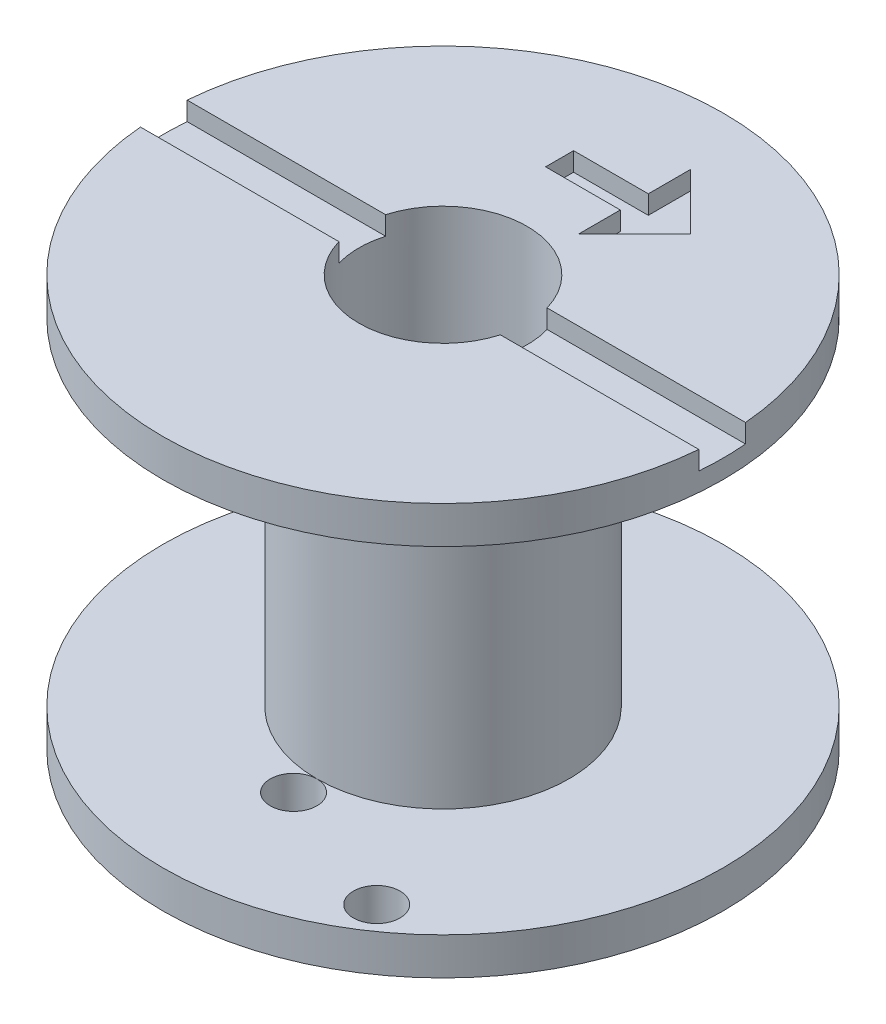
ISO-10303-21;
HEADER;
FILE_DESCRIPTION(('STEP AP214'),'2;1');
FILE_NAME('part.step','',(''),(''),'','','');
FILE_SCHEMA(('AUTOMOTIVE_DESIGN { 1 0 10303 214 1 1 1 1 }'));
ENDSEC;
DATA;
#1=APPLICATION_CONTEXT('core data for automotive mechanical design processes');
#2=APPLICATION_PROTOCOL_DEFINITION('international standard','automotive_design',2000,#1);
#3=PRODUCT_CONTEXT('',#1,'mechanical');
#4=PRODUCT('Part','Part','',(#3));
#5=PRODUCT_RELATED_PRODUCT_CATEGORY('part','',(#4));
#6=PRODUCT_DEFINITION_FORMATION('','',#4);
#7=PRODUCT_DEFINITION_CONTEXT('part definition',#1,'design');
#8=PRODUCT_DEFINITION('design','',#6,#7);
#9=PRODUCT_DEFINITION_SHAPE('','',#8);
#10=(LENGTH_UNIT() NAMED_UNIT(*) SI_UNIT(.MILLI.,.METRE.));
#11=(NAMED_UNIT(*) PLANE_ANGLE_UNIT() SI_UNIT($,.RADIAN.));
#12=(NAMED_UNIT(*) SI_UNIT($,.STERADIAN.) SOLID_ANGLE_UNIT());
#13=UNCERTAINTY_MEASURE_WITH_UNIT(LENGTH_MEASURE(1.E-05),#10,'distance_accuracy_value','');
#14=(GEOMETRIC_REPRESENTATION_CONTEXT(3) GLOBAL_UNCERTAINTY_ASSIGNED_CONTEXT((#13)) GLOBAL_UNIT_ASSIGNED_CONTEXT((#10,
#11,#12)) REPRESENTATION_CONTEXT('',''));
#15=CARTESIAN_POINT('',(0.,0.,0.));
#16=DIRECTION('',(0.,0.,1.));
#17=DIRECTION('',(1.,0.,0.));
#18=AXIS2_PLACEMENT_3D('',#15,#16,#17);
#19=CARTESIAN_POINT('',(0.,11.,15.));
#20=DIRECTION('',(0.,1.,0.));
#21=DIRECTION('',(0.,0.,1.));
#22=AXIS2_PLACEMENT_3D('',#19,#20,#21);
#23=PLANE('',#22);
#24=DIRECTION('',(1.,0.,0.));
#25=VECTOR('',#24,1.);
#26=CARTESIAN_POINT('',(0.,11.,1.25));
#27=LINE('',#26,#25);
#28=CARTESIAN_POINT('',(-14.9478259288767,11.,1.25));
#29=VERTEX_POINT('',#28);
#30=CARTESIAN_POINT('',(-4.32290411644765,11.,1.25));
#31=VERTEX_POINT('',#30);
#32=EDGE_CURVE('E265',#29,#31,#27,.T.);
#33=ORIENTED_EDGE('',*,*,#32,.F.);
#34=CARTESIAN_POINT('',(0.,11.,0.));
#35=DIRECTION('',(0.,1.,0.));
#36=DIRECTION('',(0.,0.,1.));
#37=AXIS2_PLACEMENT_3D('',#34,#35,#36);
#38=CIRCLE('',#37,15.);
#39=CARTESIAN_POINT('',(14.9478259288767,11.,1.25));
#40=VERTEX_POINT('',#39);
#41=EDGE_CURVE('E218',#29,#40,#38,.T.);
#42=ORIENTED_EDGE('',*,*,#41,.T.);
#43=CARTESIAN_POINT('',(4.32290411644765,11.,1.25));
#44=VERTEX_POINT('',#43);
#45=EDGE_CURVE('E268',#44,#40,#27,.T.);
#46=ORIENTED_EDGE('',*,*,#45,.F.);
#47=CARTESIAN_POINT('',(0.,11.,0.));
#48=DIRECTION('',(0.,1.,0.));
#49=DIRECTION('',(0.,0.,1.));
#50=AXIS2_PLACEMENT_3D('',#47,#48,#49);
#51=CIRCLE('',#50,4.50000000000001);
#52=EDGE_CURVE('E180',#31,#44,#51,.T.);
#53=ORIENTED_EDGE('',*,*,#52,.F.);
#54=EDGE_LOOP('',(#33,#42,#46,#53));
#55=FACE_BOUND('',#54,.T.);
#56=ADVANCED_FACE('F33',(#55),#23,.T.);
#57=DIRECTION('',(-1.,0.,0.));
#58=VECTOR('',#57,1.);
#59=CARTESIAN_POINT('',(0.,11.,-1.25));
#60=LINE('',#59,#58);
#61=CARTESIAN_POINT('',(14.9478259288767,11.,-1.25));
#62=VERTEX_POINT('',#61);
#63=CARTESIAN_POINT('',(4.32290411644765,11.,-1.25));
#64=VERTEX_POINT('',#63);
#65=EDGE_CURVE('E403',#62,#64,#60,.T.);
#66=ORIENTED_EDGE('',*,*,#65,.F.);
#67=CARTESIAN_POINT('',(-14.9478259288767,11.,-1.25));
#68=VERTEX_POINT('',#67);
#69=EDGE_CURVE('E222',#62,#68,#38,.T.);
#70=ORIENTED_EDGE('',*,*,#69,.T.);
#71=CARTESIAN_POINT('',(-4.32290411644765,11.,-1.25));
#72=VERTEX_POINT('',#71);
#73=EDGE_CURVE('E270',#72,#68,#60,.T.);
#74=ORIENTED_EDGE('',*,*,#73,.F.);
#75=EDGE_CURVE('E183',#64,#72,#51,.T.);
#76=ORIENTED_EDGE('',*,*,#75,.F.);
#77=EDGE_LOOP('',(#66,#70,#74,#76));
#78=FACE_BOUND('',#77,.T.);
#79=DIRECTION('',(0.,0.,1.));
#80=VECTOR('',#79,1.);
#81=CARTESIAN_POINT('',(-2.25827734000175,11.,-7.75));
#82=LINE('',#81,#80);
#83=CARTESIAN_POINT('',(-2.25827734000175,11.,-9.25));
#84=VERTEX_POINT('',#83);
#85=CARTESIAN_POINT('',(-2.25827734000175,11.,-7.75));
#86=VERTEX_POINT('',#85);
#87=EDGE_CURVE('E274',#84,#86,#82,.T.);
#88=ORIENTED_EDGE('',*,*,#87,.F.);
#89=DIRECTION('',(-1.,0.,0.));
#90=VECTOR('',#89,1.);
#91=CARTESIAN_POINT('',(-2.25827734000175,11.,-9.25));
#92=LINE('',#91,#90);
#93=CARTESIAN_POINT('',(1.74172265999826,11.,-9.25));
#94=VERTEX_POINT('',#93);
#95=EDGE_CURVE('E285',#94,#84,#92,.T.);
#96=ORIENTED_EDGE('',*,*,#95,.F.);
#97=DIRECTION('',(0.,0.,1.));
#98=VECTOR('',#97,1.);
#99=CARTESIAN_POINT('',(1.74172265999826,11.,-9.25));
#100=LINE('',#99,#98);
#101=CARTESIAN_POINT('',(1.74172265999825,11.,-11.5000002328018));
#102=VERTEX_POINT('',#101);
#103=EDGE_CURVE('E314',#102,#94,#100,.T.);
#104=ORIENTED_EDGE('',*,*,#103,.F.);
#105=DIRECTION('',(-0.707106753750594,0.,-0.7071068086225));
#106=VECTOR('',#105,1.);
#107=CARTESIAN_POINT('',(1.74172265999825,11.,-11.5000002328018));
#108=LINE('',#107,#106);
#109=CARTESIAN_POINT('',(4.74172265999825,11.,-8.5));
#110=VERTEX_POINT('',#109);
#111=EDGE_CURVE('E311',#110,#102,#108,.T.);
#112=ORIENTED_EDGE('',*,*,#111,.F.);
#113=DIRECTION('',(0.707106808622502,0.,-0.707106753750592));
#114=VECTOR('',#113,1.);
#115=CARTESIAN_POINT('',(4.74172265999825,11.,-8.5));
#116=LINE('',#115,#114);
#117=CARTESIAN_POINT('',(1.74172265999825,11.,-5.50000023280179));
#118=VERTEX_POINT('',#117);
#119=EDGE_CURVE('E308',#118,#110,#116,.T.);
#120=ORIENTED_EDGE('',*,*,#119,.F.);
#121=DIRECTION('',(0.,0.,1.));
#122=VECTOR('',#121,1.);
#123=CARTESIAN_POINT('',(1.74172265999825,11.,-5.50000023280179));
#124=LINE('',#123,#122);
#125=CARTESIAN_POINT('',(1.74172265999826,11.,-7.75));
#126=VERTEX_POINT('',#125);
#127=EDGE_CURVE('E305',#126,#118,#124,.T.);
#128=ORIENTED_EDGE('',*,*,#127,.F.);
#129=DIRECTION('',(1.,0.,0.));
#130=VECTOR('',#129,1.);
#131=CARTESIAN_POINT('',(1.74172265999826,11.,-7.75));
#132=LINE('',#131,#130);
#133=EDGE_CURVE('E278',#86,#126,#132,.T.);
#134=ORIENTED_EDGE('',*,*,#133,.F.);
#135=EDGE_LOOP('',(#88,#96,#104,#112,#120,#128,#134));
#136=FACE_BOUND('',#135,.T.);
#137=ADVANCED_FACE('F35',(#78,#136),#23,.T.);
#138=CARTESIAN_POINT('',(0.,15.5,0.));
#139=DIRECTION('',(0.,1.,0.));
#140=DIRECTION('',(0.,0.,1.));
#141=AXIS2_PLACEMENT_3D('',#138,#139,#140);
#142=CYLINDRICAL_SURFACE('',#141,4.5);
#143=DIRECTION('',(0.,1.,0.));
#144=VECTOR('',#143,1.);
#145=CARTESIAN_POINT('',(4.32290411644765,15.5,1.25));
#146=LINE('',#145,#144);
#147=CARTESIAN_POINT('',(4.32290411644765,9.99999999999998,1.25));
#148=VERTEX_POINT('',#147);
#149=EDGE_CURVE('E272',#148,#44,#146,.T.);
#150=ORIENTED_EDGE('',*,*,#149,.F.);
#151=CARTESIAN_POINT('',(0.,9.99999999999998,0.));
#152=DIRECTION('',(0.,-1.,0.));
#153=DIRECTION('',(0.,0.,-1.));
#154=AXIS2_PLACEMENT_3D('',#151,#152,#153);
#155=CIRCLE('',#154,4.5);
#156=CARTESIAN_POINT('',(4.32290411644765,9.99999999999998,-1.25));
#157=VERTEX_POINT('',#156);
#158=EDGE_CURVE('E402',#157,#148,#155,.T.);
#159=ORIENTED_EDGE('',*,*,#158,.F.);
#160=DIRECTION('',(0.,1.,0.));
#161=VECTOR('',#160,1.);
#162=CARTESIAN_POINT('',(4.32290411644765,15.5,-1.25));
#163=LINE('',#162,#161);
#164=EDGE_CURVE('E405',#64,#157,#163,.F.);
#165=ORIENTED_EDGE('',*,*,#164,.F.);
#166=ORIENTED_EDGE('',*,*,#75,.T.);
#167=DIRECTION('',(0.,1.,0.));
#168=VECTOR('',#167,1.);
#169=CARTESIAN_POINT('',(-4.32290411644765,15.5,-1.25));
#170=LINE('',#169,#168);
#171=CARTESIAN_POINT('',(-4.32290411644765,9.99999999999998,-1.25));
#172=VERTEX_POINT('',#171);
#173=EDGE_CURVE('E266',#172,#72,#170,.T.);
#174=ORIENTED_EDGE('',*,*,#173,.F.);
#175=CARTESIAN_POINT('',(-4.32290411644765,9.99999999999998,1.25));
#176=VERTEX_POINT('',#175);
#177=EDGE_CURVE('E400',#176,#172,#155,.T.);
#178=ORIENTED_EDGE('',*,*,#177,.F.);
#179=DIRECTION('',(0.,1.,0.));
#180=VECTOR('',#179,1.);
#181=CARTESIAN_POINT('',(-4.32290411644765,15.5,1.25));
#182=LINE('',#181,#180);
#183=EDGE_CURVE('E210',#31,#176,#182,.F.);
#184=ORIENTED_EDGE('',*,*,#183,.F.);
#185=ORIENTED_EDGE('',*,*,#52,.T.);
#186=EDGE_LOOP('',(#150,#159,#165,#166,#174,#178,#184,#185));
#187=FACE_BOUND('',#186,.T.);
#188=CARTESIAN_POINT('',(0.,-13.,0.));
#189=DIRECTION('',(0.,1.,0.));
#190=DIRECTION('',(0.,0.,1.));
#191=AXIS2_PLACEMENT_3D('',#188,#189,#190);
#192=CIRCLE('',#191,4.5);
#193=CARTESIAN_POINT('',(0.,-13.,4.5));
#194=VERTEX_POINT('',#193);
#195=EDGE_CURVE('E171',#194,#194,#192,.T.);
#196=ORIENTED_EDGE('',*,*,#195,.F.);
#197=EDGE_LOOP('',(#196));
#198=FACE_BOUND('',#197,.T.);
#199=ADVANCED_FACE('F262',(#187,#198),#142,.F.);
#200=CARTESIAN_POINT('',(0.,-13.,8.5));
#201=DIRECTION('',(0.,-1.,0.));
#202=DIRECTION('',(0.,0.,-1.));
#203=AXIS2_PLACEMENT_3D('',#200,#201,#202);
#204=PLANE('',#203);
#205=CARTESIAN_POINT('',(0.,-13.,8.));
#206=DIRECTION('',(0.,-1.,0.));
#207=DIRECTION('',(0.,0.,-1.));
#208=AXIS2_PLACEMENT_3D('',#205,#206,#207);
#209=CIRCLE('',#208,1.25);
#210=CARTESIAN_POINT('',(-1.17805013646425,-13.,8.41796875));
#211=VERTEX_POINT('',#210);
#212=CARTESIAN_POINT('',(1.17805013646425,-13.,8.41796875));
#213=VERTEX_POINT('',#212);
#214=EDGE_CURVE('E392',#211,#213,#209,.T.);
#215=ORIENTED_EDGE('',*,*,#214,.F.);
#216=CARTESIAN_POINT('',(0.,-13.,0.));
#217=DIRECTION('',(0.,1.,0.));
#218=DIRECTION('',(0.,0.,1.));
#219=AXIS2_PLACEMENT_3D('',#216,#217,#218);
#220=CIRCLE('',#219,8.5);
#221=EDGE_CURVE('E165',#213,#211,#220,.T.);
#222=ORIENTED_EDGE('',*,*,#221,.F.);
#223=EDGE_LOOP('',(#215,#222));
#224=FACE_BOUND('',#223,.T.);
#225=ORIENTED_EDGE('',*,*,#195,.T.);
#226=EDGE_LOOP('',(#225));
#227=FACE_BOUND('',#226,.T.);
#228=ADVANCED_FACE('F505',(#224,#227),#204,.T.);
#229=CARTESIAN_POINT('',(0.,15.5,0.));
#230=DIRECTION('',(0.,1.,0.));
#231=DIRECTION('',(0.,0.,1.));
#232=AXIS2_PLACEMENT_3D('',#229,#230,#231);
#233=CYLINDRICAL_SURFACE('',#232,8.5);
#234=DIRECTION('',(0.,-1.,0.));
#235=VECTOR('',#234,1.);
#236=CARTESIAN_POINT('',(1.17805013646425,-11.,8.41796875));
#237=LINE('',#236,#235);
#238=CARTESIAN_POINT('',(1.17805013646425,-11.,8.41796875));
#239=VERTEX_POINT('',#238);
#240=EDGE_CURVE('E49',#213,#239,#237,.F.);
#241=ORIENTED_EDGE('',*,*,#240,.F.);
#242=ORIENTED_EDGE('',*,*,#221,.T.);
#243=DIRECTION('',(0.,-1.,0.));
#244=VECTOR('',#243,1.);
#245=CARTESIAN_POINT('',(-1.17805013646425,-11.,8.41796875));
#246=LINE('',#245,#244);
#247=CARTESIAN_POINT('',(-1.17805013646425,-11.,8.41796875));
#248=VERTEX_POINT('',#247);
#249=EDGE_CURVE('E154',#248,#211,#246,.T.);
#250=ORIENTED_EDGE('',*,*,#249,.F.);
#251=CARTESIAN_POINT('',(0.,-11.,0.));
#252=DIRECTION('',(0.,1.,0.));
#253=DIRECTION('',(0.,0.,1.));
#254=AXIS2_PLACEMENT_3D('',#251,#252,#253);
#255=CIRCLE('',#254,8.5);
#256=EDGE_CURVE('E163',#239,#248,#255,.T.);
#257=ORIENTED_EDGE('',*,*,#256,.F.);
#258=EDGE_LOOP('',(#241,#242,#250,#257));
#259=FACE_BOUND('',#258,.T.);
#260=ADVANCED_FACE('F162',(#259),#233,.T.);
#261=CARTESIAN_POINT('',(0.,-11.,15.));
#262=DIRECTION('',(0.,-1.,0.));
#263=DIRECTION('',(0.,0.,-1.));
#264=AXIS2_PLACEMENT_3D('',#261,#262,#263);
#265=PLANE('',#264);
#266=CARTESIAN_POINT('',(0.,-11.,8.));
#267=DIRECTION('',(0.,-1.,0.));
#268=DIRECTION('',(0.,0.,-1.));
#269=AXIS2_PLACEMENT_3D('',#266,#267,#268);
#270=CIRCLE('',#269,1.25);
#271=EDGE_CURVE('E151',#239,#248,#270,.T.);
#272=ORIENTED_EDGE('',*,*,#271,.F.);
#273=ORIENTED_EDGE('',*,*,#256,.T.);
#274=EDGE_LOOP('',(#272,#273));
#275=FACE_BOUND('',#274,.T.);
#276=CARTESIAN_POINT('',(7.42542500182777,-11.,10.973858188542));
#277=DIRECTION('',(0.,-1.,0.));
#278=DIRECTION('',(0.,0.,-1.));
#279=AXIS2_PLACEMENT_3D('',#276,#277,#278);
#280=CIRCLE('',#279,1.25);
#281=CARTESIAN_POINT('',(7.42542500182777,-11.,9.72385818854203));
#282=VERTEX_POINT('',#281);
#283=EDGE_CURVE('E394',#282,#282,#280,.T.);
#284=ORIENTED_EDGE('',*,*,#283,.F.);
#285=EDGE_LOOP('',(#284));
#286=FACE_BOUND('',#285,.T.);
#287=CARTESIAN_POINT('',(0.,-11.,0.));
#288=DIRECTION('',(0.,1.,0.));
#289=DIRECTION('',(0.,0.,1.));
#290=AXIS2_PLACEMENT_3D('',#287,#288,#289);
#291=CIRCLE('',#290,15.);
#292=CARTESIAN_POINT('',(0.,-11.,15.));
#293=VERTEX_POINT('',#292);
#294=EDGE_CURVE('E169',#293,#293,#291,.T.);
#295=ORIENTED_EDGE('',*,*,#294,.F.);
#296=EDGE_LOOP('',(#295));
#297=FACE_BOUND('',#296,.T.);
#298=ADVANCED_FACE('F167',(#275,#286,#297),#265,.T.);
#299=CARTESIAN_POINT('',(0.,15.5,0.));
#300=DIRECTION('',(0.,1.,0.));
#301=DIRECTION('',(0.,0.,1.));
#302=AXIS2_PLACEMENT_3D('',#299,#300,#301);
#303=CYLINDRICAL_SURFACE('',#302,15.);
#304=ORIENTED_EDGE('',*,*,#294,.T.);
#305=EDGE_LOOP('',(#304));
#306=FACE_BOUND('',#305,.T.);
#307=CARTESIAN_POINT('',(0.,-9.,0.));
#308=DIRECTION('',(0.,1.,0.));
#309=DIRECTION('',(0.,0.,1.));
#310=AXIS2_PLACEMENT_3D('',#307,#308,#309);
#311=CIRCLE('',#310,15.);
#312=CARTESIAN_POINT('',(0.,-9.,15.));
#313=VERTEX_POINT('',#312);
#314=EDGE_CURVE('E174',#313,#313,#311,.T.);
#315=ORIENTED_EDGE('',*,*,#314,.F.);
#316=EDGE_LOOP('',(#315));
#317=FACE_BOUND('',#316,.T.);
#318=ADVANCED_FACE('F246',(#306,#317),#303,.T.);
#319=CARTESIAN_POINT('',(0.,-9.,15.));
#320=DIRECTION('',(0.,1.,0.));
#321=DIRECTION('',(0.,0.,1.));
#322=AXIS2_PLACEMENT_3D('',#319,#320,#321);
#323=PLANE('',#322);
#324=CARTESIAN_POINT('',(7.42542500182777,-9.,10.973858188542));
#325=DIRECTION('',(0.,1.,0.));
#326=DIRECTION('',(0.,0.,1.));
#327=AXIS2_PLACEMENT_3D('',#324,#325,#326);
#328=CIRCLE('',#327,1.25);
#329=CARTESIAN_POINT('',(7.42542500182777,-9.,12.223858188542));
#330=VERTEX_POINT('',#329);
#331=EDGE_CURVE('E37',#330,#330,#328,.T.);
#332=ORIENTED_EDGE('',*,*,#331,.F.);
#333=EDGE_LOOP('',(#332));
#334=FACE_BOUND('',#333,.T.);
#335=ORIENTED_EDGE('',*,*,#314,.T.);
#336=EDGE_LOOP('',(#335));
#337=FACE_BOUND('',#336,.T.);
#338=CARTESIAN_POINT('',(0.,-9.,0.));
#339=DIRECTION('',(0.,1.,0.));
#340=DIRECTION('',(0.,0.,1.));
#341=AXIS2_PLACEMENT_3D('',#338,#339,#340);
#342=CIRCLE('',#341,6.75);
#343=CARTESIAN_POINT('',(0.,-9.,6.75));
#344=VERTEX_POINT('',#343);
#345=EDGE_CURVE('E238',#344,#344,#342,.T.);
#346=ORIENTED_EDGE('',*,*,#345,.F.);
#347=CARTESIAN_POINT('',(0.,-9.,8.));
#348=DIRECTION('',(0.,1.,0.));
#349=DIRECTION('',(0.,0.,1.));
#350=AXIS2_PLACEMENT_3D('',#347,#348,#349);
#351=CIRCLE('',#350,1.25);
#352=EDGE_CURVE('E55',#344,#344,#351,.T.);
#353=ORIENTED_EDGE('',*,*,#352,.F.);
#354=EDGE_LOOP('',(#346,#353));
#355=FACE_BOUND('',#354,.T.);
#356=ADVANCED_FACE('F243',(#334,#337,#355),#323,.T.);
#357=CARTESIAN_POINT('',(0.,15.5,0.));
#358=DIRECTION('',(0.,1.,0.));
#359=DIRECTION('',(0.,0.,1.));
#360=AXIS2_PLACEMENT_3D('',#357,#358,#359);
#361=CYLINDRICAL_SURFACE('',#360,6.75);
#362=ORIENTED_EDGE('',*,*,#345,.T.);
#363=EDGE_LOOP('',(#362));
#364=FACE_BOUND('',#363,.T.);
#365=CARTESIAN_POINT('',(0.,9.,0.));
#366=DIRECTION('',(0.,1.,0.));
#367=DIRECTION('',(0.,0.,1.));
#368=AXIS2_PLACEMENT_3D('',#365,#366,#367);
#369=CIRCLE('',#368,6.75);
#370=CARTESIAN_POINT('',(0.,9.,6.75));
#371=VERTEX_POINT('',#370);
#372=EDGE_CURVE('E235',#371,#371,#369,.T.);
#373=ORIENTED_EDGE('',*,*,#372,.F.);
#374=EDGE_LOOP('',(#373));
#375=FACE_BOUND('',#374,.T.);
#376=ADVANCED_FACE('F254',(#364,#375),#361,.T.);
#377=CARTESIAN_POINT('',(0.,9.,15.));
#378=DIRECTION('',(0.,-1.,0.));
#379=DIRECTION('',(0.,0.,-1.));
#380=AXIS2_PLACEMENT_3D('',#377,#378,#379);
#381=PLANE('',#380);
#382=ORIENTED_EDGE('',*,*,#372,.T.);
#383=EDGE_LOOP('',(#382));
#384=FACE_BOUND('',#383,.T.);
#385=CARTESIAN_POINT('',(0.,8.99999999999999,0.));
#386=DIRECTION('',(0.,1.,0.));
#387=DIRECTION('',(0.,0.,1.));
#388=AXIS2_PLACEMENT_3D('',#385,#386,#387);
#389=CIRCLE('',#388,15.);
#390=CARTESIAN_POINT('',(0.,8.99999999999999,15.));
#391=VERTEX_POINT('',#390);
#392=EDGE_CURVE('E226',#391,#391,#389,.T.);
#393=ORIENTED_EDGE('',*,*,#392,.F.);
#394=EDGE_LOOP('',(#393));
#395=FACE_BOUND('',#394,.T.);
#396=ADVANCED_FACE('F376',(#384,#395),#381,.T.);
#397=CARTESIAN_POINT('',(0.,15.5,0.));
#398=DIRECTION('',(0.,1.,0.));
#399=DIRECTION('',(0.,0.,1.));
#400=AXIS2_PLACEMENT_3D('',#397,#398,#399);
#401=CYLINDRICAL_SURFACE('',#400,15.);
#402=DIRECTION('',(0.,1.,0.));
#403=VECTOR('',#402,1.);
#404=CARTESIAN_POINT('',(-14.9478259288767,15.5,1.25));
#405=LINE('',#404,#403);
#406=CARTESIAN_POINT('',(-14.9478259288767,9.99999999999998,1.25));
#407=VERTEX_POINT('',#406);
#408=EDGE_CURVE('E11',#407,#29,#405,.T.);
#409=ORIENTED_EDGE('',*,*,#408,.F.);
#410=CARTESIAN_POINT('',(0.,9.99999999999998,0.));
#411=DIRECTION('',(0.,-1.,0.));
#412=DIRECTION('',(0.,0.,-1.));
#413=AXIS2_PLACEMENT_3D('',#410,#411,#412);
#414=CIRCLE('',#413,15.);
#415=CARTESIAN_POINT('',(-14.9478259288767,9.99999999999998,-1.25));
#416=VERTEX_POINT('',#415);
#417=EDGE_CURVE('E187',#416,#407,#414,.F.);
#418=ORIENTED_EDGE('',*,*,#417,.F.);
#419=DIRECTION('',(0.,1.,0.));
#420=VECTOR('',#419,1.);
#421=CARTESIAN_POINT('',(-14.9478259288767,15.5,-1.25));
#422=LINE('',#421,#420);
#423=EDGE_CURVE('E42',#68,#416,#422,.F.);
#424=ORIENTED_EDGE('',*,*,#423,.F.);
#425=ORIENTED_EDGE('',*,*,#69,.F.);
#426=DIRECTION('',(0.,1.,0.));
#427=VECTOR('',#426,1.);
#428=CARTESIAN_POINT('',(14.9478259288767,15.5,-1.25));
#429=LINE('',#428,#427);
#430=CARTESIAN_POINT('',(14.9478259288767,9.99999999999998,-1.25));
#431=VERTEX_POINT('',#430);
#432=EDGE_CURVE('E186',#431,#62,#429,.T.);
#433=ORIENTED_EDGE('',*,*,#432,.F.);
#434=CARTESIAN_POINT('',(14.9478259288767,9.99999999999998,1.25));
#435=VERTEX_POINT('',#434);
#436=EDGE_CURVE('E184',#435,#431,#414,.F.);
#437=ORIENTED_EDGE('',*,*,#436,.F.);
#438=DIRECTION('',(0.,1.,0.));
#439=VECTOR('',#438,1.);
#440=CARTESIAN_POINT('',(14.9478259288767,15.5,1.25));
#441=LINE('',#440,#439);
#442=EDGE_CURVE('E189',#40,#435,#441,.F.);
#443=ORIENTED_EDGE('',*,*,#442,.F.);
#444=ORIENTED_EDGE('',*,*,#41,.F.);
#445=EDGE_LOOP('',(#409,#418,#424,#425,#433,#437,#443,#444));
#446=FACE_BOUND('',#445,.T.);
#447=ORIENTED_EDGE('',*,*,#392,.T.);
#448=EDGE_LOOP('',(#447));
#449=FACE_BOUND('',#448,.T.);
#450=ADVANCED_FACE('F214',(#446,#449),#401,.T.);
#451=CARTESIAN_POINT('',(-2.25827734000175,9.99999999999999,-7.75));
#452=DIRECTION('',(-1.,0.,0.));
#453=DIRECTION('',(0.,0.,1.));
#454=AXIS2_PLACEMENT_3D('',#451,#452,#453);
#455=PLANE('',#454);
#456=ORIENTED_EDGE('',*,*,#87,.T.);
#457=DIRECTION('',(0.,1.,0.));
#458=VECTOR('',#457,1.);
#459=CARTESIAN_POINT('',(-2.25827734000175,9.99999999999999,-7.75));
#460=LINE('',#459,#458);
#461=CARTESIAN_POINT('',(-2.25827734000175,9.99999999999999,-7.75));
#462=VERTEX_POINT('',#461);
#463=EDGE_CURVE('E231',#462,#86,#460,.T.);
#464=ORIENTED_EDGE('',*,*,#463,.F.);
#465=DIRECTION('',(0.,0.,1.));
#466=VECTOR('',#465,1.);
#467=CARTESIAN_POINT('',(-2.25827734000175,9.99999999999999,-7.75));
#468=LINE('',#467,#466);
#469=CARTESIAN_POINT('',(-2.25827734000175,9.99999999999999,-9.25));
#470=VERTEX_POINT('',#469);
#471=EDGE_CURVE('E281',#470,#462,#468,.T.);
#472=ORIENTED_EDGE('',*,*,#471,.F.);
#473=DIRECTION('',(0.,1.,0.));
#474=VECTOR('',#473,1.);
#475=CARTESIAN_POINT('',(-2.25827734000175,9.99999999999999,-9.25));
#476=LINE('',#475,#474);
#477=EDGE_CURVE('E223',#470,#84,#476,.T.);
#478=ORIENTED_EDGE('',*,*,#477,.T.);
#479=EDGE_LOOP('',(#456,#464,#472,#478));
#480=FACE_BOUND('',#479,.T.);
#481=ADVANCED_FACE('F349',(#480),#455,.F.);
#482=CARTESIAN_POINT('',(-2.25827734000175,9.99999999999999,-9.25));
#483=DIRECTION('',(0.,0.,-1.));
#484=DIRECTION('',(-1.,0.,0.));
#485=AXIS2_PLACEMENT_3D('',#482,#483,#484);
#486=PLANE('',#485);
#487=ORIENTED_EDGE('',*,*,#95,.T.);
#488=ORIENTED_EDGE('',*,*,#477,.F.);
#489=DIRECTION('',(-1.,0.,0.));
#490=VECTOR('',#489,1.);
#491=CARTESIAN_POINT('',(-2.25827734000175,9.99999999999999,-9.25));
#492=LINE('',#491,#490);
#493=CARTESIAN_POINT('',(1.74172265999826,9.99999999999999,-9.25));
#494=VERTEX_POINT('',#493);
#495=EDGE_CURVE('E300',#494,#470,#492,.T.);
#496=ORIENTED_EDGE('',*,*,#495,.F.);
#497=DIRECTION('',(0.,1.,0.));
#498=VECTOR('',#497,1.);
#499=CARTESIAN_POINT('',(1.74172265999826,9.99999999999999,-9.25));
#500=LINE('',#499,#498);
#501=EDGE_CURVE('E227',#494,#94,#500,.T.);
#502=ORIENTED_EDGE('',*,*,#501,.T.);
#503=EDGE_LOOP('',(#487,#488,#496,#502));
#504=FACE_BOUND('',#503,.T.);
#505=ADVANCED_FACE('F351',(#504),#486,.F.);
#506=CARTESIAN_POINT('',(1.74172265999826,9.99999999999999,-9.25));
#507=DIRECTION('',(-1.,0.,0.));
#508=DIRECTION('',(0.,0.,1.));
#509=AXIS2_PLACEMENT_3D('',#506,#507,#508);
#510=PLANE('',#509);
#511=ORIENTED_EDGE('',*,*,#103,.T.);
#512=ORIENTED_EDGE('',*,*,#501,.F.);
#513=DIRECTION('',(0.,0.,1.));
#514=VECTOR('',#513,1.);
#515=CARTESIAN_POINT('',(1.74172265999826,9.99999999999999,-9.25));
#516=LINE('',#515,#514);
#517=CARTESIAN_POINT('',(1.74172265999825,9.99999999999999,-11.5000002328018));
#518=VERTEX_POINT('',#517);
#519=EDGE_CURVE('E297',#518,#494,#516,.T.);
#520=ORIENTED_EDGE('',*,*,#519,.F.);
#521=DIRECTION('',(0.,1.,0.));
#522=VECTOR('',#521,1.);
#523=CARTESIAN_POINT('',(1.74172265999825,9.99999999999999,-11.5000002328018));
#524=LINE('',#523,#522);
#525=EDGE_CURVE('E320',#518,#102,#524,.T.);
#526=ORIENTED_EDGE('',*,*,#525,.T.);
#527=EDGE_LOOP('',(#511,#512,#520,#526));
#528=FACE_BOUND('',#527,.T.);
#529=ADVANCED_FACE('F354',(#528),#510,.F.);
#530=CARTESIAN_POINT('',(1.74172265999825,9.99999999999999,-11.5000002328018));
#531=DIRECTION('',(0.7071068086225,0.,-0.707106753750594));
#532=DIRECTION('',(-0.707106753750594,0.,-0.7071068086225));
#533=AXIS2_PLACEMENT_3D('',#530,#531,#532);
#534=PLANE('',#533);
#535=ORIENTED_EDGE('',*,*,#111,.T.);
#536=ORIENTED_EDGE('',*,*,#525,.F.);
#537=DIRECTION('',(-0.707106753750594,0.,-0.7071068086225));
#538=VECTOR('',#537,1.);
#539=CARTESIAN_POINT('',(1.74172265999825,9.99999999999999,-11.5000002328018));
#540=LINE('',#539,#538);
#541=CARTESIAN_POINT('',(4.74172265999825,9.99999999999999,-8.5));
#542=VERTEX_POINT('',#541);
#543=EDGE_CURVE('E294',#542,#518,#540,.T.);
#544=ORIENTED_EDGE('',*,*,#543,.F.);
#545=DIRECTION('',(0.,1.,0.));
#546=VECTOR('',#545,1.);
#547=CARTESIAN_POINT('',(4.74172265999825,9.99999999999999,-8.5));
#548=LINE('',#547,#546);
#549=EDGE_CURVE('E322',#542,#110,#548,.T.);
#550=ORIENTED_EDGE('',*,*,#549,.T.);
#551=EDGE_LOOP('',(#535,#536,#544,#550));
#552=FACE_BOUND('',#551,.T.);
#553=ADVANCED_FACE('F357',(#552),#534,.F.);
#554=CARTESIAN_POINT('',(4.74172265999825,9.99999999999999,-8.5));
#555=DIRECTION('',(0.707106753750592,0.,0.707106808622502));
#556=DIRECTION('',(0.707106808622502,0.,-0.707106753750592));
#557=AXIS2_PLACEMENT_3D('',#554,#555,#556);
#558=PLANE('',#557);
#559=ORIENTED_EDGE('',*,*,#119,.T.);
#560=ORIENTED_EDGE('',*,*,#549,.F.);
#561=DIRECTION('',(0.707106808622502,0.,-0.707106753750592));
#562=VECTOR('',#561,1.);
#563=CARTESIAN_POINT('',(4.74172265999825,9.99999999999999,-8.5));
#564=LINE('',#563,#562);
#565=CARTESIAN_POINT('',(1.74172265999825,9.99999999999999,-5.50000023280179));
#566=VERTEX_POINT('',#565);
#567=EDGE_CURVE('E291',#566,#542,#564,.T.);
#568=ORIENTED_EDGE('',*,*,#567,.F.);
#569=DIRECTION('',(0.,1.,0.));
#570=VECTOR('',#569,1.);
#571=CARTESIAN_POINT('',(1.74172265999825,9.99999999999999,-5.50000023280179));
#572=LINE('',#571,#570);
#573=EDGE_CURVE('E324',#566,#118,#572,.T.);
#574=ORIENTED_EDGE('',*,*,#573,.T.);
#575=EDGE_LOOP('',(#559,#560,#568,#574));
#576=FACE_BOUND('',#575,.T.);
#577=ADVANCED_FACE('F344',(#576),#558,.F.);
#578=CARTESIAN_POINT('',(1.74172265999825,9.99999999999999,-5.50000023280179));
#579=DIRECTION('',(-1.,0.,0.));
#580=DIRECTION('',(0.,0.,1.));
#581=AXIS2_PLACEMENT_3D('',#578,#579,#580);
#582=PLANE('',#581);
#583=ORIENTED_EDGE('',*,*,#127,.T.);
#584=ORIENTED_EDGE('',*,*,#573,.F.);
#585=DIRECTION('',(0.,0.,1.));
#586=VECTOR('',#585,1.);
#587=CARTESIAN_POINT('',(1.74172265999825,9.99999999999999,-5.50000023280179));
#588=LINE('',#587,#586);
#589=CARTESIAN_POINT('',(1.74172265999826,9.99999999999999,-7.75));
#590=VERTEX_POINT('',#589);
#591=EDGE_CURVE('E288',#590,#566,#588,.T.);
#592=ORIENTED_EDGE('',*,*,#591,.F.);
#593=DIRECTION('',(0.,1.,0.));
#594=VECTOR('',#593,1.);
#595=CARTESIAN_POINT('',(1.74172265999826,9.99999999999999,-7.75));
#596=LINE('',#595,#594);
#597=EDGE_CURVE('E325',#590,#126,#596,.T.);
#598=ORIENTED_EDGE('',*,*,#597,.T.);
#599=EDGE_LOOP('',(#583,#584,#592,#598));
#600=FACE_BOUND('',#599,.T.);
#601=ADVANCED_FACE('F341',(#600),#582,.F.);
#602=CARTESIAN_POINT('',(1.74172265999826,9.99999999999999,-7.75));
#603=DIRECTION('',(0.,0.,1.));
#604=DIRECTION('',(1.,0.,0.));
#605=AXIS2_PLACEMENT_3D('',#602,#603,#604);
#606=PLANE('',#605);
#607=ORIENTED_EDGE('',*,*,#133,.T.);
#608=ORIENTED_EDGE('',*,*,#597,.F.);
#609=DIRECTION('',(1.,0.,0.));
#610=VECTOR('',#609,1.);
#611=CARTESIAN_POINT('',(1.74172265999826,9.99999999999999,-7.75));
#612=LINE('',#611,#610);
#613=EDGE_CURVE('E284',#462,#590,#612,.T.);
#614=ORIENTED_EDGE('',*,*,#613,.F.);
#615=ORIENTED_EDGE('',*,*,#463,.T.);
#616=EDGE_LOOP('',(#607,#608,#614,#615));
#617=FACE_BOUND('',#616,.T.);
#618=ADVANCED_FACE('F332',(#617),#606,.F.);
#619=CARTESIAN_POINT('',(0.,9.99999999999999,0.));
#620=DIRECTION('',(0.,-1.,0.));
#621=DIRECTION('',(0.,0.,-1.));
#622=AXIS2_PLACEMENT_3D('',#619,#620,#621);
#623=PLANE('',#622);
#624=ORIENTED_EDGE('',*,*,#471,.T.);
#625=ORIENTED_EDGE('',*,*,#613,.T.);
#626=ORIENTED_EDGE('',*,*,#591,.T.);
#627=ORIENTED_EDGE('',*,*,#567,.T.);
#628=ORIENTED_EDGE('',*,*,#543,.T.);
#629=ORIENTED_EDGE('',*,*,#519,.T.);
#630=ORIENTED_EDGE('',*,*,#495,.T.);
#631=EDGE_LOOP('',(#624,#625,#626,#627,#628,#629,#630));
#632=FACE_BOUND('',#631,.T.);
#633=ADVANCED_FACE('F347',(#632),#623,.F.);
#634=CARTESIAN_POINT('',(0.,9.99999999999998,0.));
#635=DIRECTION('',(0.,-1.,0.));
#636=DIRECTION('',(0.,0.,-1.));
#637=AXIS2_PLACEMENT_3D('',#634,#635,#636);
#638=PLANE('',#637);
#639=ORIENTED_EDGE('',*,*,#158,.T.);
#640=DIRECTION('',(-1.,0.,0.));
#641=VECTOR('',#640,1.);
#642=CARTESIAN_POINT('',(21.3058325983219,9.99999999999998,1.25));
#643=LINE('',#642,#641);
#644=EDGE_CURVE('E211',#435,#148,#643,.T.);
#645=ORIENTED_EDGE('',*,*,#644,.F.);
#646=ORIENTED_EDGE('',*,*,#436,.T.);
#647=DIRECTION('',(1.,0.,0.));
#648=VECTOR('',#647,1.);
#649=CARTESIAN_POINT('',(21.3058325983219,9.99999999999998,-1.25));
#650=LINE('',#649,#648);
#651=EDGE_CURVE('E397',#157,#431,#650,.T.);
#652=ORIENTED_EDGE('',*,*,#651,.F.);
#653=EDGE_LOOP('',(#639,#645,#646,#652));
#654=FACE_BOUND('',#653,.T.);
#655=ADVANCED_FACE('F422',(#654),#638,.F.);
#656=CARTESIAN_POINT('',(21.3058325983219,28.,-1.25));
#657=DIRECTION('',(0.,0.,-1.));
#658=DIRECTION('',(-1.,0.,0.));
#659=AXIS2_PLACEMENT_3D('',#656,#657,#658);
#660=PLANE('',#659);
#661=ORIENTED_EDGE('',*,*,#164,.T.);
#662=ORIENTED_EDGE('',*,*,#651,.T.);
#663=ORIENTED_EDGE('',*,*,#432,.T.);
#664=ORIENTED_EDGE('',*,*,#65,.T.);
#665=EDGE_LOOP('',(#661,#662,#663,#664));
#666=FACE_BOUND('',#665,.T.);
#667=ADVANCED_FACE('F417',(#666),#660,.F.);
#668=CARTESIAN_POINT('',(21.3058325983219,28.,1.25));
#669=DIRECTION('',(0.,0.,1.));
#670=DIRECTION('',(1.,0.,0.));
#671=AXIS2_PLACEMENT_3D('',#668,#669,#670);
#672=PLANE('',#671);
#673=ORIENTED_EDGE('',*,*,#149,.T.);
#674=ORIENTED_EDGE('',*,*,#45,.T.);
#675=ORIENTED_EDGE('',*,*,#442,.T.);
#676=ORIENTED_EDGE('',*,*,#644,.T.);
#677=EDGE_LOOP('',(#673,#674,#675,#676));
#678=FACE_BOUND('',#677,.T.);
#679=ADVANCED_FACE('F423',(#678),#672,.F.);
#680=ORIENTED_EDGE('',*,*,#173,.T.);
#681=ORIENTED_EDGE('',*,*,#73,.T.);
#682=ORIENTED_EDGE('',*,*,#423,.T.);
#683=EDGE_CURVE('E203',#416,#172,#650,.T.);
#684=ORIENTED_EDGE('',*,*,#683,.T.);
#685=EDGE_LOOP('',(#680,#681,#682,#684));
#686=FACE_BOUND('',#685,.T.);
#687=ADVANCED_FACE('F410',(#686),#660,.F.);
#688=ORIENTED_EDGE('',*,*,#183,.T.);
#689=EDGE_CURVE('E201',#176,#407,#643,.T.);
#690=ORIENTED_EDGE('',*,*,#689,.T.);
#691=ORIENTED_EDGE('',*,*,#408,.T.);
#692=ORIENTED_EDGE('',*,*,#32,.T.);
#693=EDGE_LOOP('',(#688,#690,#691,#692));
#694=FACE_BOUND('',#693,.T.);
#695=ADVANCED_FACE('F207',(#694),#672,.F.);
#696=ORIENTED_EDGE('',*,*,#177,.T.);
#697=ORIENTED_EDGE('',*,*,#683,.F.);
#698=ORIENTED_EDGE('',*,*,#417,.T.);
#699=ORIENTED_EDGE('',*,*,#689,.F.);
#700=EDGE_LOOP('',(#696,#697,#698,#699));
#701=FACE_BOUND('',#700,.T.);
#702=ADVANCED_FACE('F200',(#701),#638,.F.);
#703=CARTESIAN_POINT('',(7.42542500182777,-1.5,10.973858188542));
#704=DIRECTION('',(0.,-1.,0.));
#705=DIRECTION('',(0.,0.,-1.));
#706=AXIS2_PLACEMENT_3D('',#703,#704,#705);
#707=CYLINDRICAL_SURFACE('',#706,1.25);
#708=ORIENTED_EDGE('',*,*,#283,.T.);
#709=EDGE_LOOP('',(#708));
#710=FACE_BOUND('',#709,.T.);
#711=ORIENTED_EDGE('',*,*,#331,.T.);
#712=EDGE_LOOP('',(#711));
#713=FACE_BOUND('',#712,.T.);
#714=ADVANCED_FACE('F436',(#710,#713),#707,.F.);
#715=CARTESIAN_POINT('',(0.,-1.5,8.));
#716=DIRECTION('',(0.,-1.,0.));
#717=DIRECTION('',(0.,0.,-1.));
#718=AXIS2_PLACEMENT_3D('',#715,#716,#717);
#719=CYLINDRICAL_SURFACE('',#718,1.25);
#720=ORIENTED_EDGE('',*,*,#214,.T.);
#721=ORIENTED_EDGE('',*,*,#240,.T.);
#722=ORIENTED_EDGE('',*,*,#271,.T.);
#723=ORIENTED_EDGE('',*,*,#249,.T.);
#724=EDGE_LOOP('',(#720,#721,#722,#723));
#725=FACE_BOUND('',#724,.T.);
#726=ORIENTED_EDGE('',*,*,#352,.T.);
#727=EDGE_LOOP('',(#726));
#728=FACE_BOUND('',#727,.T.);
#729=ADVANCED_FACE('F153',(#725,#728),#719,.F.);
#730=CLOSED_SHELL('',(#56,#137,#199,#228,#260,#298,#318,#356,#376,#396,#450,#481,#505,#529,#553,
#577,#601,#618,#633,#655,#667,#679,#687,#695,#702,#714,#729));
#731=MANIFOLD_SOLID_BREP('B2',#730);
#732=ADVANCED_BREP_SHAPE_REPRESENTATION('',(#18,#731),#14);
#733=SHAPE_DEFINITION_REPRESENTATION(#9,#732);
ENDSEC;
END-ISO-10303-21;
